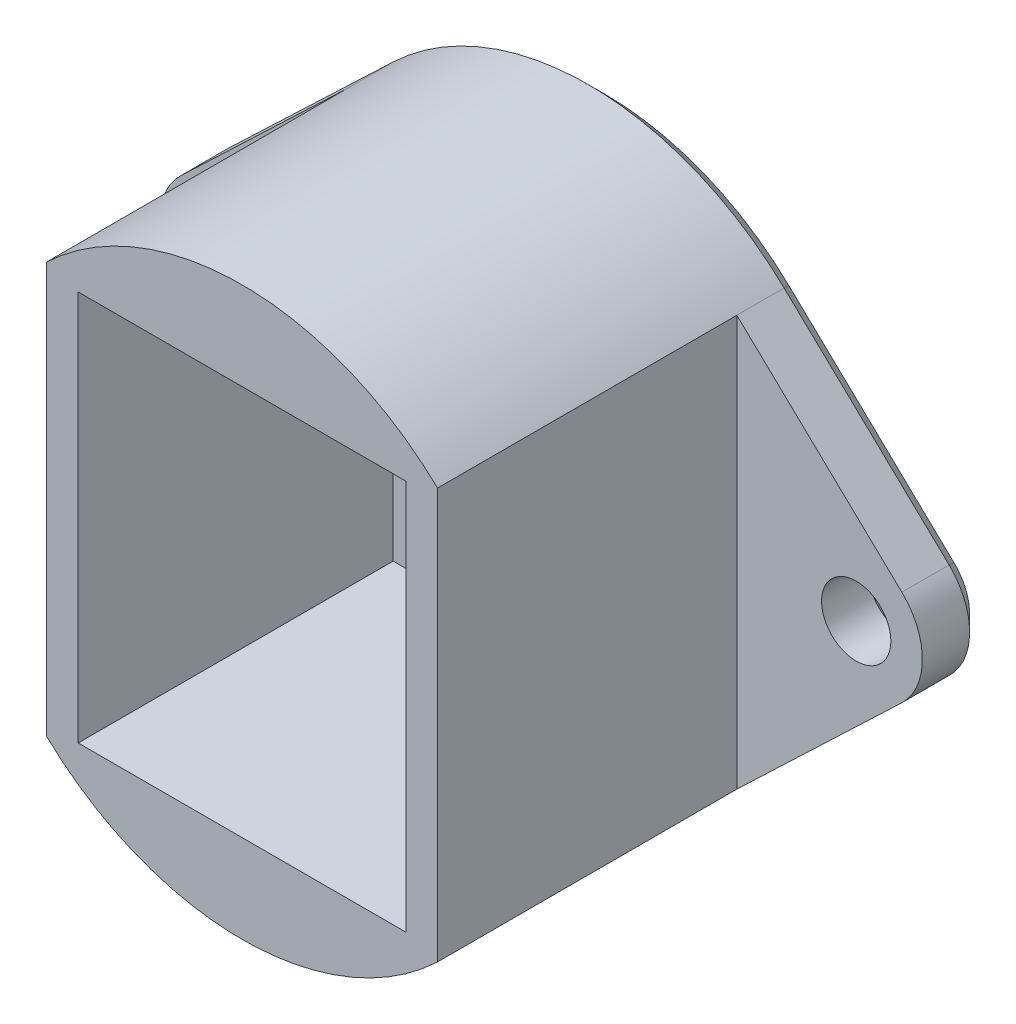
ISO-10303-21;
HEADER;
FILE_DESCRIPTION(('STEP AP214'),'2;1');
FILE_NAME('part.step','',(''),(''),'','','');
FILE_SCHEMA(('AUTOMOTIVE_DESIGN { 1 0 10303 214 1 1 1 1 }'));
ENDSEC;
DATA;
#1=APPLICATION_CONTEXT('core data for automotive mechanical design processes');
#2=APPLICATION_PROTOCOL_DEFINITION('international standard','automotive_design',2000,#1);
#3=PRODUCT_CONTEXT('',#1,'mechanical');
#4=PRODUCT('Part','Part','',(#3));
#5=PRODUCT_RELATED_PRODUCT_CATEGORY('part','',(#4));
#6=PRODUCT_DEFINITION_FORMATION('','',#4);
#7=PRODUCT_DEFINITION_CONTEXT('part definition',#1,'design');
#8=PRODUCT_DEFINITION('design','',#6,#7);
#9=PRODUCT_DEFINITION_SHAPE('','',#8);
#10=(LENGTH_UNIT() NAMED_UNIT(*) SI_UNIT(.MILLI.,.METRE.));
#11=(NAMED_UNIT(*) PLANE_ANGLE_UNIT() SI_UNIT($,.RADIAN.));
#12=(NAMED_UNIT(*) SI_UNIT($,.STERADIAN.) SOLID_ANGLE_UNIT());
#13=UNCERTAINTY_MEASURE_WITH_UNIT(LENGTH_MEASURE(1.E-05),#10,'distance_accuracy_value','');
#14=(GEOMETRIC_REPRESENTATION_CONTEXT(3) GLOBAL_UNCERTAINTY_ASSIGNED_CONTEXT((#13)) GLOBAL_UNIT_ASSIGNED_CONTEXT((#10,
#11,#12)) REPRESENTATION_CONTEXT('',''));
#15=CARTESIAN_POINT('',(0.,0.,0.));
#16=DIRECTION('',(0.,0.,1.));
#17=DIRECTION('',(1.,0.,0.));
#18=AXIS2_PLACEMENT_3D('',#15,#16,#17);
#19=CARTESIAN_POINT('',(0.,0.,2.));
#20=DIRECTION('',(0.,0.,-1.));
#21=DIRECTION('',(-1.,0.,0.));
#22=AXIS2_PLACEMENT_3D('',#19,#20,#21);
#23=CYLINDRICAL_SURFACE('',#22,1.7);
#24=CARTESIAN_POINT('',(0.,0.,0.500000000000002));
#25=DIRECTION('',(0.,0.,1.));
#26=DIRECTION('',(1.,0.,0.));
#27=AXIS2_PLACEMENT_3D('',#24,#25,#26);
#28=CIRCLE('',#27,1.7);
#29=CARTESIAN_POINT('',(1.7,0.,0.500000000000002));
#30=VERTEX_POINT('',#29);
#31=EDGE_CURVE('E324',#30,#30,#28,.F.);
#32=ORIENTED_EDGE('',*,*,#31,.T.);
#33=EDGE_LOOP('',(#32));
#34=FACE_BOUND('',#33,.T.);
#35=CARTESIAN_POINT('',(0.,0.,0.6));
#36=DIRECTION('',(0.,0.,1.));
#37=DIRECTION('',(1.,0.,0.));
#38=AXIS2_PLACEMENT_3D('',#35,#36,#37);
#39=CIRCLE('',#38,1.7);
#40=CARTESIAN_POINT('',(1.7,0.,0.6));
#41=VERTEX_POINT('',#40);
#42=EDGE_CURVE('E193',#41,#41,#39,.T.);
#43=ORIENTED_EDGE('',*,*,#42,.T.);
#44=EDGE_LOOP('',(#43));
#45=FACE_BOUND('',#44,.T.);
#46=ADVANCED_FACE('F37',(#34,#45),#23,.F.);
#47=CARTESIAN_POINT('',(0.,0.,2.));
#48=DIRECTION('',(0.,0.,1.));
#49=DIRECTION('',(1.,0.,0.));
#50=AXIS2_PLACEMENT_3D('',#47,#48,#49);
#51=PLANE('',#50);
#52=DIRECTION('',(0.,-1.,0.));
#53=VECTOR('',#52,1.);
#54=CARTESIAN_POINT('',(-6.21000000000001,-6.51428430451113,2.));
#55=LINE('',#54,#53);
#56=CARTESIAN_POINT('',(-6.21000000000001,6.51428430451113,2.));
#57=VERTEX_POINT('',#56);
#58=CARTESIAN_POINT('',(-6.21,-6.51428430451113,2.));
#59=VERTEX_POINT('',#58);
#60=EDGE_CURVE('E236',#57,#59,#55,.T.);
#61=ORIENTED_EDGE('',*,*,#60,.F.);
#62=DIRECTION('',(-0.723809367167902,-0.690000000000001,0.));
#63=VECTOR('',#62,1.);
#64=CARTESIAN_POINT('',(-6.21000000000001,6.51428430451113,2.));
#65=LINE('',#64,#63);
#66=CARTESIAN_POINT('',(-11.449,1.5199996710526,2.));
#67=VERTEX_POINT('',#66);
#68=EDGE_CURVE('E259',#57,#67,#65,.T.);
#69=ORIENTED_EDGE('',*,*,#68,.T.);
#70=CARTESIAN_POINT('',(-10.,0.,2.));
#71=DIRECTION('',(0.,0.,1.));
#72=DIRECTION('',(-1.,0.,0.));
#73=AXIS2_PLACEMENT_3D('',#70,#71,#72);
#74=CIRCLE('',#73,2.1);
#75=CARTESIAN_POINT('',(-11.449,-1.5199996710526,2.));
#76=VERTEX_POINT('',#75);
#77=EDGE_CURVE('E261',#67,#76,#74,.T.);
#78=ORIENTED_EDGE('',*,*,#77,.T.);
#79=DIRECTION('',(0.723809367167903,-0.69,0.));
#80=VECTOR('',#79,1.);
#81=CARTESIAN_POINT('',(-6.21,-6.51428430451113,2.));
#82=LINE('',#81,#80);
#83=EDGE_CURVE('E263',#76,#59,#82,.T.);
#84=ORIENTED_EDGE('',*,*,#83,.T.);
#85=EDGE_LOOP('',(#61,#69,#78,#84));
#86=FACE_BOUND('',#85,.T.);
#87=CARTESIAN_POINT('',(-10.,0.,2.));
#88=DIRECTION('',(0.,0.,1.));
#89=DIRECTION('',(1.,0.,0.));
#90=AXIS2_PLACEMENT_3D('',#87,#88,#89);
#91=CIRCLE('',#90,1.1);
#92=CARTESIAN_POINT('',(-8.9,0.,2.));
#93=VERTEX_POINT('',#92);
#94=EDGE_CURVE('E253',#93,#93,#91,.T.);
#95=ORIENTED_EDGE('',*,*,#94,.F.);
#96=EDGE_LOOP('',(#95));
#97=FACE_BOUND('',#96,.T.);
#98=ADVANCED_FACE('F402',(#86,#97),#51,.T.);
#99=DIRECTION('',(0.,1.,0.));
#100=VECTOR('',#99,1.);
#101=CARTESIAN_POINT('',(6.21000000000001,6.51428430451113,2.));
#102=LINE('',#101,#100);
#103=CARTESIAN_POINT('',(6.21,-6.51428430451113,2.));
#104=VERTEX_POINT('',#103);
#105=CARTESIAN_POINT('',(6.21000000000001,6.51428430451113,2.));
#106=VERTEX_POINT('',#105);
#107=EDGE_CURVE('E233',#104,#106,#102,.T.);
#108=ORIENTED_EDGE('',*,*,#107,.F.);
#109=DIRECTION('',(0.723809367167903,0.69,0.));
#110=VECTOR('',#109,1.);
#111=CARTESIAN_POINT('',(11.449,-1.51999967105259,2.));
#112=LINE('',#111,#110);
#113=CARTESIAN_POINT('',(11.449,-1.51999967105259,2.));
#114=VERTEX_POINT('',#113);
#115=EDGE_CURVE('E265',#104,#114,#112,.T.);
#116=ORIENTED_EDGE('',*,*,#115,.T.);
#117=CARTESIAN_POINT('',(10.,0.,2.));
#118=DIRECTION('',(0.,0.,1.));
#119=DIRECTION('',(-1.,0.,0.));
#120=AXIS2_PLACEMENT_3D('',#117,#118,#119);
#121=CIRCLE('',#120,2.1);
#122=CARTESIAN_POINT('',(11.449,1.5199996710526,2.));
#123=VERTEX_POINT('',#122);
#124=EDGE_CURVE('E267',#114,#123,#121,.T.);
#125=ORIENTED_EDGE('',*,*,#124,.T.);
#126=DIRECTION('',(-0.723809367167903,0.69,0.));
#127=VECTOR('',#126,1.);
#128=CARTESIAN_POINT('',(6.21000000000001,6.51428430451113,2.));
#129=LINE('',#128,#127);
#130=EDGE_CURVE('E269',#123,#106,#129,.T.);
#131=ORIENTED_EDGE('',*,*,#130,.T.);
#132=EDGE_LOOP('',(#108,#116,#125,#131));
#133=FACE_BOUND('',#132,.T.);
#134=CARTESIAN_POINT('',(10.,0.,2.));
#135=DIRECTION('',(0.,0.,1.));
#136=DIRECTION('',(1.,0.,0.));
#137=AXIS2_PLACEMENT_3D('',#134,#135,#136);
#138=CIRCLE('',#137,1.1);
#139=CARTESIAN_POINT('',(11.1,0.,2.));
#140=VERTEX_POINT('',#139);
#141=EDGE_CURVE('E256',#140,#140,#138,.T.);
#142=ORIENTED_EDGE('',*,*,#141,.F.);
#143=EDGE_LOOP('',(#142));
#144=FACE_BOUND('',#143,.T.);
#145=ADVANCED_FACE('F408',(#133,#144),#51,.T.);
#146=CARTESIAN_POINT('',(0.,0.,0.));
#147=DIRECTION('',(0.,0.,1.));
#148=DIRECTION('',(1.,0.,0.));
#149=AXIS2_PLACEMENT_3D('',#146,#147,#148);
#150=PLANE('',#149);
#151=CARTESIAN_POINT('',(0.,0.,0.));
#152=DIRECTION('',(0.,0.,1.));
#153=DIRECTION('',(1.,0.,0.));
#154=AXIS2_PLACEMENT_3D('',#151,#152,#153);
#155=CIRCLE('',#154,2.2);
#156=CARTESIAN_POINT('',(2.2,0.,0.));
#157=VERTEX_POINT('',#156);
#158=EDGE_CURVE('E318',#157,#157,#155,.T.);
#159=ORIENTED_EDGE('',*,*,#158,.T.);
#160=EDGE_LOOP('',(#159));
#161=FACE_BOUND('',#160,.T.);
#162=CARTESIAN_POINT('',(0.,-4.5,0.));
#163=DIRECTION('',(0.,0.,1.));
#164=DIRECTION('',(1.,0.,0.));
#165=AXIS2_PLACEMENT_3D('',#162,#163,#164);
#166=CIRCLE('',#165,1.49999999999999);
#167=CARTESIAN_POINT('',(1.49999999999999,-4.5,0.));
#168=VERTEX_POINT('',#167);
#169=EDGE_CURVE('E315',#168,#168,#166,.T.);
#170=ORIENTED_EDGE('',*,*,#169,.T.);
#171=EDGE_LOOP('',(#170));
#172=FACE_BOUND('',#171,.T.);
#173=CARTESIAN_POINT('',(0.,4.5,0.));
#174=DIRECTION('',(0.,0.,1.));
#175=DIRECTION('',(1.,0.,0.));
#176=AXIS2_PLACEMENT_3D('',#173,#174,#175);
#177=CIRCLE('',#176,1.49999999999999);
#178=CARTESIAN_POINT('',(1.49999999999999,4.5,0.));
#179=VERTEX_POINT('',#178);
#180=EDGE_CURVE('E312',#179,#179,#177,.T.);
#181=ORIENTED_EDGE('',*,*,#180,.T.);
#182=EDGE_LOOP('',(#181));
#183=FACE_BOUND('',#182,.T.);
#184=DIRECTION('',(-0.723809367167903,0.69,0.));
#185=VECTOR('',#184,1.);
#186=CARTESIAN_POINT('',(-5.865,-6.15237962092718,0.));
#187=LINE('',#186,#185);
#188=CARTESIAN_POINT('',(-5.865,-6.15237962092718,0.));
#189=VERTEX_POINT('',#188);
#190=CARTESIAN_POINT('',(-11.104,-1.15809498746864,0.));
#191=VERTEX_POINT('',#190);
#192=EDGE_CURVE('E308',#189,#191,#187,.T.);
#193=ORIENTED_EDGE('',*,*,#192,.T.);
#194=CARTESIAN_POINT('',(-10.,0.,0.));
#195=DIRECTION('',(0.,0.,1.));
#196=DIRECTION('',(1.,0.,0.));
#197=AXIS2_PLACEMENT_3D('',#194,#195,#196);
#198=CIRCLE('',#197,1.6);
#199=CARTESIAN_POINT('',(-8.4,0.,0.));
#200=VERTEX_POINT('',#199);
#201=EDGE_CURVE('E310',#191,#200,#198,.T.);
#202=ORIENTED_EDGE('',*,*,#201,.T.);
#203=CARTESIAN_POINT('',(-10.,0.,0.));
#204=DIRECTION('',(0.,0.,1.));
#205=DIRECTION('',(1.,0.,0.));
#206=AXIS2_PLACEMENT_3D('',#203,#204,#205);
#207=CIRCLE('',#206,1.6);
#208=CARTESIAN_POINT('',(-11.104,1.15809498746864,0.));
#209=VERTEX_POINT('',#208);
#210=EDGE_CURVE('E301',#200,#209,#207,.T.);
#211=ORIENTED_EDGE('',*,*,#210,.T.);
#212=DIRECTION('',(0.723809367167902,0.690000000000001,0.));
#213=VECTOR('',#212,1.);
#214=CARTESIAN_POINT('',(-5.86500000000001,6.15237962092717,0.));
#215=LINE('',#214,#213);
#216=CARTESIAN_POINT('',(-5.86500000000001,6.15237962092717,0.));
#217=VERTEX_POINT('',#216);
#218=EDGE_CURVE('E297',#209,#217,#215,.T.);
#219=ORIENTED_EDGE('',*,*,#218,.T.);
#220=CARTESIAN_POINT('',(0.,0.,0.));
#221=DIRECTION('',(0.,0.,1.));
#222=DIRECTION('',(1.,0.,0.));
#223=AXIS2_PLACEMENT_3D('',#220,#221,#222);
#224=CIRCLE('',#223,8.5);
#225=CARTESIAN_POINT('',(5.865,6.15237962092717,0.));
#226=VERTEX_POINT('',#225);
#227=EDGE_CURVE('E292',#217,#226,#224,.F.);
#228=ORIENTED_EDGE('',*,*,#227,.T.);
#229=DIRECTION('',(0.723809367167903,-0.69,0.));
#230=VECTOR('',#229,1.);
#231=CARTESIAN_POINT('',(5.86500000000001,6.15237962092718,0.));
#232=LINE('',#231,#230);
#233=CARTESIAN_POINT('',(11.104,1.15809498746865,0.));
#234=VERTEX_POINT('',#233);
#235=EDGE_CURVE('E295',#226,#234,#232,.T.);
#236=ORIENTED_EDGE('',*,*,#235,.T.);
#237=CARTESIAN_POINT('',(10.,0.,0.));
#238=DIRECTION('',(0.,0.,1.));
#239=DIRECTION('',(1.,0.,0.));
#240=AXIS2_PLACEMENT_3D('',#237,#238,#239);
#241=CIRCLE('',#240,1.6);
#242=CARTESIAN_POINT('',(11.104,-1.15809498746864,0.));
#243=VERTEX_POINT('',#242);
#244=EDGE_CURVE('E299',#234,#243,#241,.T.);
#245=ORIENTED_EDGE('',*,*,#244,.T.);
#246=DIRECTION('',(-0.723809367167903,-0.69,0.));
#247=VECTOR('',#246,1.);
#248=CARTESIAN_POINT('',(5.865,-6.15237962092717,0.));
#249=LINE('',#248,#247);
#250=CARTESIAN_POINT('',(5.865,-6.15237962092717,0.));
#251=VERTEX_POINT('',#250);
#252=EDGE_CURVE('E304',#243,#251,#249,.T.);
#253=ORIENTED_EDGE('',*,*,#252,.T.);
#254=CARTESIAN_POINT('',(0.,0.,0.));
#255=DIRECTION('',(0.,0.,1.));
#256=DIRECTION('',(1.,0.,0.));
#257=AXIS2_PLACEMENT_3D('',#254,#255,#256);
#258=CIRCLE('',#257,8.5);
#259=EDGE_CURVE('E306',#251,#189,#258,.F.);
#260=ORIENTED_EDGE('',*,*,#259,.T.);
#261=EDGE_LOOP('',(#193,#202,#211,#219,#228,#236,#245,#253,#260));
#262=FACE_BOUND('',#261,.T.);
#263=ADVANCED_FACE('F430',(#161,#172,#183,#262),#150,.F.);
#264=CARTESIAN_POINT('',(0.,0.,2.));
#265=DIRECTION('',(0.,0.,-1.));
#266=DIRECTION('',(-1.,0.,0.));
#267=AXIS2_PLACEMENT_3D('',#264,#265,#266);
#268=CYLINDRICAL_SURFACE('',#267,9.00000000000001);
#269=DIRECTION('',(0.,0.,-1.));
#270=VECTOR('',#269,1.);
#271=CARTESIAN_POINT('',(6.21000000000001,6.51428430451113,2.));
#272=LINE('',#271,#270);
#273=CARTESIAN_POINT('',(6.21000000000001,6.51428430451113,0.500000000000002));
#274=VERTEX_POINT('',#273);
#275=EDGE_CURVE('E272',#106,#274,#272,.T.);
#276=ORIENTED_EDGE('',*,*,#275,.T.);
#277=CARTESIAN_POINT('',(0.,0.,0.500000000000002));
#278=DIRECTION('',(0.,0.,1.));
#279=DIRECTION('',(1.,0.,0.));
#280=AXIS2_PLACEMENT_3D('',#277,#278,#279);
#281=CIRCLE('',#280,9.00000000000001);
#282=CARTESIAN_POINT('',(-6.21000000000001,6.51428430451113,0.500000000000002));
#283=VERTEX_POINT('',#282);
#284=EDGE_CURVE('E12',#274,#283,#281,.T.);
#285=ORIENTED_EDGE('',*,*,#284,.T.);
#286=DIRECTION('',(0.,0.,-1.));
#287=VECTOR('',#286,1.);
#288=CARTESIAN_POINT('',(-6.21000000000001,6.51428430451113,2.));
#289=LINE('',#288,#287);
#290=EDGE_CURVE('E290',#57,#283,#289,.T.);
#291=ORIENTED_EDGE('',*,*,#290,.F.);
#292=DIRECTION('',(0.,0.,-1.));
#293=VECTOR('',#292,1.);
#294=CARTESIAN_POINT('',(-6.21000000000001,6.51428430451113,44.8690740544725));
#295=LINE('',#294,#293);
#296=CARTESIAN_POINT('',(-6.21000000000001,6.51428430451113,11.5));
#297=VERTEX_POINT('',#296);
#298=EDGE_CURVE('E242',#297,#57,#295,.T.);
#299=ORIENTED_EDGE('',*,*,#298,.F.);
#300=CARTESIAN_POINT('',(0.,0.,11.5));
#301=DIRECTION('',(0.,0.,1.));
#302=DIRECTION('',(1.,0.,0.));
#303=AXIS2_PLACEMENT_3D('',#300,#301,#302);
#304=CIRCLE('',#303,9.00000000000001);
#305=CARTESIAN_POINT('',(6.21000000000001,6.51428430451113,11.5));
#306=VERTEX_POINT('',#305);
#307=EDGE_CURVE('E220',#306,#297,#304,.T.);
#308=ORIENTED_EDGE('',*,*,#307,.F.);
#309=DIRECTION('',(0.,0.,-1.));
#310=VECTOR('',#309,1.);
#311=CARTESIAN_POINT('',(6.21000000000001,6.51428430451113,44.8690740544725));
#312=LINE('',#311,#310);
#313=EDGE_CURVE('E245',#306,#106,#312,.T.);
#314=ORIENTED_EDGE('',*,*,#313,.T.);
#315=EDGE_LOOP('',(#276,#285,#291,#299,#308,#314));
#316=FACE_BOUND('',#315,.T.);
#317=ADVANCED_FACE('F434',(#316),#268,.T.);
#318=CARTESIAN_POINT('',(-6.21000000000001,6.51428430451113,2.));
#319=DIRECTION('',(0.690000000000001,-0.723809367167902,0.));
#320=DIRECTION('',(0.723809367167902,0.690000000000001,0.));
#321=AXIS2_PLACEMENT_3D('',#318,#319,#320);
#322=PLANE('',#321);
#323=ORIENTED_EDGE('',*,*,#290,.T.);
#324=DIRECTION('',(-0.723809367167902,-0.690000000000001,0.));
#325=VECTOR('',#324,1.);
#326=CARTESIAN_POINT('',(-6.21000000000001,6.51428430451113,0.500000000000003));
#327=LINE('',#326,#325);
#328=CARTESIAN_POINT('',(-11.449,1.5199996710526,0.500000000000002));
#329=VERTEX_POINT('',#328);
#330=EDGE_CURVE('E336',#283,#329,#327,.T.);
#331=ORIENTED_EDGE('',*,*,#330,.T.);
#332=DIRECTION('',(0.,0.,-1.));
#333=VECTOR('',#332,1.);
#334=CARTESIAN_POINT('',(-11.449,1.5199996710526,2.));
#335=LINE('',#334,#333);
#336=EDGE_CURVE('E287',#67,#329,#335,.T.);
#337=ORIENTED_EDGE('',*,*,#336,.F.);
#338=ORIENTED_EDGE('',*,*,#68,.F.);
#339=EDGE_LOOP('',(#323,#331,#337,#338));
#340=FACE_BOUND('',#339,.T.);
#341=ADVANCED_FACE('F456',(#340),#322,.F.);
#342=CARTESIAN_POINT('',(-10.,0.,2.));
#343=DIRECTION('',(0.,0.,-1.));
#344=DIRECTION('',(-1.,0.,0.));
#345=AXIS2_PLACEMENT_3D('',#342,#343,#344);
#346=CYLINDRICAL_SURFACE('',#345,2.1);
#347=ORIENTED_EDGE('',*,*,#336,.T.);
#348=CARTESIAN_POINT('',(-10.,0.,0.500000000000002));
#349=DIRECTION('',(0.,0.,1.));
#350=DIRECTION('',(1.,0.,0.));
#351=AXIS2_PLACEMENT_3D('',#348,#349,#350);
#352=CIRCLE('',#351,2.1);
#353=CARTESIAN_POINT('',(-11.449,-1.5199996710526,0.500000000000002));
#354=VERTEX_POINT('',#353);
#355=EDGE_CURVE('E339',#329,#354,#352,.T.);
#356=ORIENTED_EDGE('',*,*,#355,.T.);
#357=DIRECTION('',(0.,0.,-1.));
#358=VECTOR('',#357,1.);
#359=CARTESIAN_POINT('',(-11.449,-1.5199996710526,2.));
#360=LINE('',#359,#358);
#361=EDGE_CURVE('E284',#76,#354,#360,.T.);
#362=ORIENTED_EDGE('',*,*,#361,.F.);
#363=ORIENTED_EDGE('',*,*,#77,.F.);
#364=EDGE_LOOP('',(#347,#356,#362,#363));
#365=FACE_BOUND('',#364,.T.);
#366=ADVANCED_FACE('F452',(#365),#346,.T.);
#367=CARTESIAN_POINT('',(-6.21,-6.51428430451113,2.));
#368=DIRECTION('',(0.69,0.723809367167903,0.));
#369=DIRECTION('',(-0.723809367167903,0.69,0.));
#370=AXIS2_PLACEMENT_3D('',#367,#368,#369);
#371=PLANE('',#370);
#372=ORIENTED_EDGE('',*,*,#361,.T.);
#373=DIRECTION('',(0.723809367167903,-0.69,0.));
#374=VECTOR('',#373,1.);
#375=CARTESIAN_POINT('',(-6.21,-6.51428430451113,0.500000000000002));
#376=LINE('',#375,#374);
#377=CARTESIAN_POINT('',(-6.21,-6.51428430451113,0.500000000000002));
#378=VERTEX_POINT('',#377);
#379=EDGE_CURVE('E341',#354,#378,#376,.T.);
#380=ORIENTED_EDGE('',*,*,#379,.T.);
#381=DIRECTION('',(0.,0.,-1.));
#382=VECTOR('',#381,1.);
#383=CARTESIAN_POINT('',(-6.21,-6.51428430451113,2.));
#384=LINE('',#383,#382);
#385=EDGE_CURVE('E281',#59,#378,#384,.T.);
#386=ORIENTED_EDGE('',*,*,#385,.F.);
#387=ORIENTED_EDGE('',*,*,#83,.F.);
#388=EDGE_LOOP('',(#372,#380,#386,#387));
#389=FACE_BOUND('',#388,.T.);
#390=ADVANCED_FACE('F448',(#389),#371,.F.);
#391=CARTESIAN_POINT('',(0.,0.,2.));
#392=DIRECTION('',(0.,0.,-1.));
#393=DIRECTION('',(-1.,0.,0.));
#394=AXIS2_PLACEMENT_3D('',#391,#392,#393);
#395=CYLINDRICAL_SURFACE('',#394,9.);
#396=ORIENTED_EDGE('',*,*,#385,.T.);
#397=CARTESIAN_POINT('',(0.,0.,0.500000000000002));
#398=DIRECTION('',(0.,0.,1.));
#399=DIRECTION('',(1.,0.,0.));
#400=AXIS2_PLACEMENT_3D('',#397,#398,#399);
#401=CIRCLE('',#400,9.);
#402=CARTESIAN_POINT('',(6.21,-6.51428430451113,0.500000000000002));
#403=VERTEX_POINT('',#402);
#404=EDGE_CURVE('E343',#378,#403,#401,.T.);
#405=ORIENTED_EDGE('',*,*,#404,.T.);
#406=DIRECTION('',(0.,0.,-1.));
#407=VECTOR('',#406,1.);
#408=CARTESIAN_POINT('',(6.21,-6.51428430451113,2.));
#409=LINE('',#408,#407);
#410=EDGE_CURVE('E278',#104,#403,#409,.T.);
#411=ORIENTED_EDGE('',*,*,#410,.F.);
#412=DIRECTION('',(0.,0.,-1.));
#413=VECTOR('',#412,1.);
#414=CARTESIAN_POINT('',(6.21,-6.51428430451113,44.8690740544725));
#415=LINE('',#414,#413);
#416=CARTESIAN_POINT('',(6.21,-6.51428430451113,11.5));
#417=VERTEX_POINT('',#416);
#418=EDGE_CURVE('E248',#417,#104,#415,.T.);
#419=ORIENTED_EDGE('',*,*,#418,.F.);
#420=CARTESIAN_POINT('',(0.,0.,11.5));
#421=DIRECTION('',(0.,0.,1.));
#422=DIRECTION('',(1.,0.,0.));
#423=AXIS2_PLACEMENT_3D('',#420,#421,#422);
#424=CIRCLE('',#423,9.00000000000001);
#425=CARTESIAN_POINT('',(-6.21000000000001,-6.51428430451113,11.5));
#426=VERTEX_POINT('',#425);
#427=EDGE_CURVE('E226',#426,#417,#424,.T.);
#428=ORIENTED_EDGE('',*,*,#427,.F.);
#429=DIRECTION('',(0.,0.,-1.));
#430=VECTOR('',#429,1.);
#431=CARTESIAN_POINT('',(-6.21000000000001,-6.51428430451113,44.8690740544725));
#432=LINE('',#431,#430);
#433=EDGE_CURVE('E239',#426,#59,#432,.T.);
#434=ORIENTED_EDGE('',*,*,#433,.T.);
#435=EDGE_LOOP('',(#396,#405,#411,#419,#428,#434));
#436=FACE_BOUND('',#435,.T.);
#437=ADVANCED_FACE('F444',(#436),#395,.T.);
#438=CARTESIAN_POINT('',(11.449,-1.51999967105259,2.));
#439=DIRECTION('',(-0.69,0.723809367167903,0.));
#440=DIRECTION('',(-0.723809367167903,-0.69,0.));
#441=AXIS2_PLACEMENT_3D('',#438,#439,#440);
#442=PLANE('',#441);
#443=ORIENTED_EDGE('',*,*,#410,.T.);
#444=DIRECTION('',(0.723809367167903,0.69,0.));
#445=VECTOR('',#444,1.);
#446=CARTESIAN_POINT('',(11.449,-1.51999967105259,0.500000000000002));
#447=LINE('',#446,#445);
#448=CARTESIAN_POINT('',(11.449,-1.51999967105259,0.500000000000002));
#449=VERTEX_POINT('',#448);
#450=EDGE_CURVE('E345',#403,#449,#447,.T.);
#451=ORIENTED_EDGE('',*,*,#450,.T.);
#452=DIRECTION('',(0.,0.,-1.));
#453=VECTOR('',#452,1.);
#454=CARTESIAN_POINT('',(11.449,-1.51999967105259,2.));
#455=LINE('',#454,#453);
#456=EDGE_CURVE('E276',#114,#449,#455,.T.);
#457=ORIENTED_EDGE('',*,*,#456,.F.);
#458=ORIENTED_EDGE('',*,*,#115,.F.);
#459=EDGE_LOOP('',(#443,#451,#457,#458));
#460=FACE_BOUND('',#459,.T.);
#461=ADVANCED_FACE('F441',(#460),#442,.F.);
#462=CARTESIAN_POINT('',(10.,0.,2.));
#463=DIRECTION('',(0.,0.,-1.));
#464=DIRECTION('',(-1.,0.,0.));
#465=AXIS2_PLACEMENT_3D('',#462,#463,#464);
#466=CYLINDRICAL_SURFACE('',#465,2.1);
#467=ORIENTED_EDGE('',*,*,#456,.T.);
#468=CARTESIAN_POINT('',(10.,0.,0.500000000000002));
#469=DIRECTION('',(0.,0.,1.));
#470=DIRECTION('',(1.,0.,0.));
#471=AXIS2_PLACEMENT_3D('',#468,#469,#470);
#472=CIRCLE('',#471,2.1);
#473=CARTESIAN_POINT('',(11.449,1.5199996710526,0.500000000000002));
#474=VERTEX_POINT('',#473);
#475=EDGE_CURVE('E61',#449,#474,#472,.T.);
#476=ORIENTED_EDGE('',*,*,#475,.T.);
#477=DIRECTION('',(0.,0.,-1.));
#478=VECTOR('',#477,1.);
#479=CARTESIAN_POINT('',(11.449,1.5199996710526,2.));
#480=LINE('',#479,#478);
#481=EDGE_CURVE('E274',#123,#474,#480,.T.);
#482=ORIENTED_EDGE('',*,*,#481,.F.);
#483=ORIENTED_EDGE('',*,*,#124,.F.);
#484=EDGE_LOOP('',(#467,#476,#482,#483));
#485=FACE_BOUND('',#484,.T.);
#486=ADVANCED_FACE('F438',(#485),#466,.T.);
#487=CARTESIAN_POINT('',(6.21000000000001,6.51428430451113,2.));
#488=DIRECTION('',(-0.69,-0.723809367167903,0.));
#489=DIRECTION('',(0.723809367167903,-0.69,0.));
#490=AXIS2_PLACEMENT_3D('',#487,#488,#489);
#491=PLANE('',#490);
#492=ORIENTED_EDGE('',*,*,#481,.T.);
#493=DIRECTION('',(-0.723809367167903,0.69,0.));
#494=VECTOR('',#493,1.);
#495=CARTESIAN_POINT('',(6.21000000000001,6.51428430451113,0.500000000000002));
#496=LINE('',#495,#494);
#497=EDGE_CURVE('E46',#474,#274,#496,.T.);
#498=ORIENTED_EDGE('',*,*,#497,.T.);
#499=ORIENTED_EDGE('',*,*,#275,.F.);
#500=ORIENTED_EDGE('',*,*,#130,.F.);
#501=EDGE_LOOP('',(#492,#498,#499,#500));
#502=FACE_BOUND('',#501,.T.);
#503=ADVANCED_FACE('F426',(#502),#491,.F.);
#504=CARTESIAN_POINT('',(10.,0.,2.));
#505=DIRECTION('',(0.,0.,-1.));
#506=DIRECTION('',(-1.,0.,0.));
#507=AXIS2_PLACEMENT_3D('',#504,#505,#506);
#508=CYLINDRICAL_SURFACE('',#507,1.1);
#509=CARTESIAN_POINT('',(10.,0.,0.500000000000007));
#510=DIRECTION('',(0.,0.,1.));
#511=DIRECTION('',(1.,0.,0.));
#512=AXIS2_PLACEMENT_3D('',#509,#510,#511);
#513=CIRCLE('',#512,1.1);
#514=CARTESIAN_POINT('',(11.1,0.,0.500000000000007));
#515=VERTEX_POINT('',#514);
#516=EDGE_CURVE('E333',#515,#515,#513,.F.);
#517=ORIENTED_EDGE('',*,*,#516,.T.);
#518=EDGE_LOOP('',(#517));
#519=FACE_BOUND('',#518,.T.);
#520=ORIENTED_EDGE('',*,*,#141,.T.);
#521=EDGE_LOOP('',(#520));
#522=FACE_BOUND('',#521,.T.);
#523=ADVANCED_FACE('F423',(#519,#522),#508,.F.);
#524=CARTESIAN_POINT('',(0.,4.5,2.));
#525=DIRECTION('',(0.,0.,-1.));
#526=DIRECTION('',(-1.,0.,0.));
#527=AXIS2_PLACEMENT_3D('',#524,#525,#526);
#528=CYLINDRICAL_SURFACE('',#527,1.);
#529=CARTESIAN_POINT('',(0.,4.5,0.499999999999998));
#530=DIRECTION('',(0.,0.,1.));
#531=DIRECTION('',(1.,0.,0.));
#532=AXIS2_PLACEMENT_3D('',#529,#530,#531);
#533=CIRCLE('',#532,1.);
#534=CARTESIAN_POINT('',(1.,4.5,0.499999999999998));
#535=VERTEX_POINT('',#534);
#536=EDGE_CURVE('E330',#535,#535,#533,.F.);
#537=ORIENTED_EDGE('',*,*,#536,.T.);
#538=EDGE_LOOP('',(#537));
#539=FACE_BOUND('',#538,.T.);
#540=CARTESIAN_POINT('',(0.,4.5,1.5));
#541=DIRECTION('',(0.,0.,-1.));
#542=DIRECTION('',(-1.,0.,0.));
#543=AXIS2_PLACEMENT_3D('',#540,#541,#542);
#544=CIRCLE('',#543,1.);
#545=CARTESIAN_POINT('',(-1.,4.5,1.5));
#546=VERTEX_POINT('',#545);
#547=EDGE_CURVE('E207',#546,#546,#544,.T.);
#548=ORIENTED_EDGE('',*,*,#547,.F.);
#549=EDGE_LOOP('',(#548));
#550=FACE_BOUND('',#549,.T.);
#551=ADVANCED_FACE('F419',(#539,#550),#528,.F.);
#552=CARTESIAN_POINT('',(0.,-4.5,2.));
#553=DIRECTION('',(0.,0.,-1.));
#554=DIRECTION('',(-1.,0.,0.));
#555=AXIS2_PLACEMENT_3D('',#552,#553,#554);
#556=CYLINDRICAL_SURFACE('',#555,1.);
#557=CARTESIAN_POINT('',(0.,-4.5,0.499999999999998));
#558=DIRECTION('',(0.,0.,1.));
#559=DIRECTION('',(1.,0.,0.));
#560=AXIS2_PLACEMENT_3D('',#557,#558,#559);
#561=CIRCLE('',#560,1.);
#562=CARTESIAN_POINT('',(1.,-4.5,0.499999999999998));
#563=VERTEX_POINT('',#562);
#564=EDGE_CURVE('E327',#563,#563,#561,.F.);
#565=ORIENTED_EDGE('',*,*,#564,.T.);
#566=EDGE_LOOP('',(#565));
#567=FACE_BOUND('',#566,.T.);
#568=CARTESIAN_POINT('',(0.,-4.5,1.5));
#569=DIRECTION('',(0.,0.,-1.));
#570=DIRECTION('',(-1.,0.,0.));
#571=AXIS2_PLACEMENT_3D('',#568,#569,#570);
#572=CIRCLE('',#571,1.);
#573=CARTESIAN_POINT('',(-1.,-4.5,1.5));
#574=VERTEX_POINT('',#573);
#575=EDGE_CURVE('E204',#574,#574,#572,.T.);
#576=ORIENTED_EDGE('',*,*,#575,.F.);
#577=EDGE_LOOP('',(#576));
#578=FACE_BOUND('',#577,.T.);
#579=ADVANCED_FACE('F416',(#567,#578),#556,.F.);
#580=CARTESIAN_POINT('',(-10.,0.,2.));
#581=DIRECTION('',(0.,0.,-1.));
#582=DIRECTION('',(-1.,0.,0.));
#583=AXIS2_PLACEMENT_3D('',#580,#581,#582);
#584=CYLINDRICAL_SURFACE('',#583,1.1);
#585=CARTESIAN_POINT('',(-10.,0.,0.500000000000007));
#586=DIRECTION('',(0.,0.,1.));
#587=DIRECTION('',(1.,0.,0.));
#588=AXIS2_PLACEMENT_3D('',#585,#586,#587);
#589=CIRCLE('',#588,1.1);
#590=CARTESIAN_POINT('',(-8.9,0.,0.500000000000007));
#591=VERTEX_POINT('',#590);
#592=EDGE_CURVE('E321',#591,#591,#589,.F.);
#593=ORIENTED_EDGE('',*,*,#592,.T.);
#594=EDGE_LOOP('',(#593));
#595=FACE_BOUND('',#594,.T.);
#596=ORIENTED_EDGE('',*,*,#94,.T.);
#597=EDGE_LOOP('',(#596));
#598=FACE_BOUND('',#597,.T.);
#599=ADVANCED_FACE('F414',(#595,#598),#584,.F.);
#600=CARTESIAN_POINT('',(-6.21000000000001,-6.51428430451113,44.8690740544725));
#601=DIRECTION('',(1.,0.,0.));
#602=DIRECTION('',(0.,0.,-1.));
#603=AXIS2_PLACEMENT_3D('',#600,#601,#602);
#604=PLANE('',#603);
#605=DIRECTION('',(0.,-1.,0.));
#606=VECTOR('',#605,1.);
#607=CARTESIAN_POINT('',(-6.21000000000001,-6.51428430451113,11.5));
#608=LINE('',#607,#606);
#609=EDGE_CURVE('E217',#297,#426,#608,.T.);
#610=ORIENTED_EDGE('',*,*,#609,.F.);
#611=ORIENTED_EDGE('',*,*,#298,.T.);
#612=ORIENTED_EDGE('',*,*,#60,.T.);
#613=ORIENTED_EDGE('',*,*,#433,.F.);
#614=EDGE_LOOP('',(#610,#611,#612,#613));
#615=FACE_BOUND('',#614,.T.);
#616=ADVANCED_FACE('F544',(#615),#604,.F.);
#617=CARTESIAN_POINT('',(6.21000000000001,6.51428430451113,44.8690740544725));
#618=DIRECTION('',(-1.,0.,0.));
#619=DIRECTION('',(0.,-1.,0.));
#620=AXIS2_PLACEMENT_3D('',#617,#618,#619);
#621=PLANE('',#620);
#622=DIRECTION('',(0.,1.,0.));
#623=VECTOR('',#622,1.);
#624=CARTESIAN_POINT('',(6.21000000000001,6.51428430451113,11.5));
#625=LINE('',#624,#623);
#626=EDGE_CURVE('E223',#417,#306,#625,.T.);
#627=ORIENTED_EDGE('',*,*,#626,.F.);
#628=ORIENTED_EDGE('',*,*,#418,.T.);
#629=ORIENTED_EDGE('',*,*,#107,.T.);
#630=ORIENTED_EDGE('',*,*,#313,.F.);
#631=EDGE_LOOP('',(#627,#628,#629,#630));
#632=FACE_BOUND('',#631,.T.);
#633=ADVANCED_FACE('F549',(#632),#621,.F.);
#634=CARTESIAN_POINT('',(5.2,6.2,44.8690740544725));
#635=DIRECTION('',(0.,-1.,0.));
#636=DIRECTION('',(1.,0.,0.));
#637=AXIS2_PLACEMENT_3D('',#634,#635,#636);
#638=PLANE('',#637);
#639=DIRECTION('',(0.,0.,-1.));
#640=VECTOR('',#639,1.);
#641=CARTESIAN_POINT('',(5.2,6.2,44.8690740544725));
#642=LINE('',#641,#640);
#643=CARTESIAN_POINT('',(5.2,6.2,11.5));
#644=VERTEX_POINT('',#643);
#645=CARTESIAN_POINT('',(5.2,6.2,1.5));
#646=VERTEX_POINT('',#645);
#647=EDGE_CURVE('E168',#644,#646,#642,.T.);
#648=ORIENTED_EDGE('',*,*,#647,.F.);
#649=DIRECTION('',(-1.,0.,0.));
#650=VECTOR('',#649,1.);
#651=CARTESIAN_POINT('',(5.2,6.2,11.5));
#652=LINE('',#651,#650);
#653=CARTESIAN_POINT('',(-5.2,6.2,11.5));
#654=VERTEX_POINT('',#653);
#655=EDGE_CURVE('E251',#644,#654,#652,.T.);
#656=ORIENTED_EDGE('',*,*,#655,.T.);
#657=DIRECTION('',(0.,0.,-1.));
#658=VECTOR('',#657,1.);
#659=CARTESIAN_POINT('',(-5.2,6.2,44.8690740544725));
#660=LINE('',#659,#658);
#661=CARTESIAN_POINT('',(-5.2,6.2,1.5));
#662=VERTEX_POINT('',#661);
#663=EDGE_CURVE('E179',#654,#662,#660,.T.);
#664=ORIENTED_EDGE('',*,*,#663,.T.);
#665=DIRECTION('',(-1.,0.,0.));
#666=VECTOR('',#665,1.);
#667=CARTESIAN_POINT('',(-5.2,6.2,1.5));
#668=LINE('',#667,#666);
#669=EDGE_CURVE('E182',#646,#662,#668,.T.);
#670=ORIENTED_EDGE('',*,*,#669,.F.);
#671=EDGE_LOOP('',(#648,#656,#664,#670));
#672=FACE_BOUND('',#671,.T.);
#673=ADVANCED_FACE('F183',(#672),#638,.T.);
#674=CARTESIAN_POINT('',(5.2,6.2,44.8690740544725));
#675=DIRECTION('',(-1.,0.,0.));
#676=DIRECTION('',(0.,-1.,0.));
#677=AXIS2_PLACEMENT_3D('',#674,#675,#676);
#678=PLANE('',#677);
#679=DIRECTION('',(0.,0.,-1.));
#680=VECTOR('',#679,1.);
#681=CARTESIAN_POINT('',(5.2,-6.2,44.8690740544725));
#682=LINE('',#681,#680);
#683=CARTESIAN_POINT('',(5.2,-6.2,11.5));
#684=VERTEX_POINT('',#683);
#685=CARTESIAN_POINT('',(5.2,-6.2,1.5));
#686=VERTEX_POINT('',#685);
#687=EDGE_CURVE('E178',#684,#686,#682,.T.);
#688=ORIENTED_EDGE('',*,*,#687,.F.);
#689=DIRECTION('',(0.,1.,0.));
#690=VECTOR('',#689,1.);
#691=CARTESIAN_POINT('',(5.2,6.2,11.5));
#692=LINE('',#691,#690);
#693=EDGE_CURVE('E175',#684,#644,#692,.T.);
#694=ORIENTED_EDGE('',*,*,#693,.T.);
#695=ORIENTED_EDGE('',*,*,#647,.T.);
#696=DIRECTION('',(0.,1.,0.));
#697=VECTOR('',#696,1.);
#698=CARTESIAN_POINT('',(5.2,-6.2,1.5));
#699=LINE('',#698,#697);
#700=EDGE_CURVE('E173',#686,#646,#699,.T.);
#701=ORIENTED_EDGE('',*,*,#700,.F.);
#702=EDGE_LOOP('',(#688,#694,#695,#701));
#703=FACE_BOUND('',#702,.T.);
#704=ADVANCED_FACE('F171',(#703),#678,.T.);
#705=CARTESIAN_POINT('',(5.2,-6.2,44.8690740544725));
#706=DIRECTION('',(0.,1.,0.));
#707=DIRECTION('',(-1.,0.,0.));
#708=AXIS2_PLACEMENT_3D('',#705,#706,#707);
#709=PLANE('',#708);
#710=DIRECTION('',(0.,0.,-1.));
#711=VECTOR('',#710,1.);
#712=CARTESIAN_POINT('',(-5.2,-6.2,44.8690740544725));
#713=LINE('',#712,#711);
#714=CARTESIAN_POINT('',(-5.2,-6.2,11.5));
#715=VERTEX_POINT('',#714);
#716=CARTESIAN_POINT('',(-5.2,-6.2,1.5));
#717=VERTEX_POINT('',#716);
#718=EDGE_CURVE('E231',#715,#717,#713,.T.);
#719=ORIENTED_EDGE('',*,*,#718,.F.);
#720=DIRECTION('',(1.,0.,0.));
#721=VECTOR('',#720,1.);
#722=CARTESIAN_POINT('',(5.2,-6.2,11.5));
#723=LINE('',#722,#721);
#724=EDGE_CURVE('E211',#715,#684,#723,.T.);
#725=ORIENTED_EDGE('',*,*,#724,.T.);
#726=ORIENTED_EDGE('',*,*,#687,.T.);
#727=DIRECTION('',(1.,0.,0.));
#728=VECTOR('',#727,1.);
#729=CARTESIAN_POINT('',(-5.2,-6.2,1.5));
#730=LINE('',#729,#728);
#731=EDGE_CURVE('E192',#717,#686,#730,.T.);
#732=ORIENTED_EDGE('',*,*,#731,.F.);
#733=EDGE_LOOP('',(#719,#725,#726,#732));
#734=FACE_BOUND('',#733,.T.);
#735=ADVANCED_FACE('F576',(#734),#709,.T.);
#736=CARTESIAN_POINT('',(-5.2,6.2,44.8690740544725));
#737=DIRECTION('',(1.,0.,0.));
#738=DIRECTION('',(0.,1.,0.));
#739=AXIS2_PLACEMENT_3D('',#736,#737,#738);
#740=PLANE('',#739);
#741=ORIENTED_EDGE('',*,*,#663,.F.);
#742=DIRECTION('',(0.,-1.,0.));
#743=VECTOR('',#742,1.);
#744=CARTESIAN_POINT('',(-5.2,6.2,11.5));
#745=LINE('',#744,#743);
#746=EDGE_CURVE('E214',#654,#715,#745,.T.);
#747=ORIENTED_EDGE('',*,*,#746,.T.);
#748=ORIENTED_EDGE('',*,*,#718,.T.);
#749=DIRECTION('',(0.,-1.,0.));
#750=VECTOR('',#749,1.);
#751=CARTESIAN_POINT('',(-5.2,-6.2,1.5));
#752=LINE('',#751,#750);
#753=EDGE_CURVE('E188',#662,#717,#752,.T.);
#754=ORIENTED_EDGE('',*,*,#753,.F.);
#755=EDGE_LOOP('',(#741,#747,#748,#754));
#756=FACE_BOUND('',#755,.T.);
#757=ADVANCED_FACE('F573',(#756),#740,.T.);
#758=CARTESIAN_POINT('',(0.,0.,11.5));
#759=DIRECTION('',(0.,0.,1.));
#760=DIRECTION('',(1.,0.,0.));
#761=AXIS2_PLACEMENT_3D('',#758,#759,#760);
#762=PLANE('',#761);
#763=ORIENTED_EDGE('',*,*,#746,.F.);
#764=ORIENTED_EDGE('',*,*,#655,.F.);
#765=ORIENTED_EDGE('',*,*,#693,.F.);
#766=ORIENTED_EDGE('',*,*,#724,.F.);
#767=EDGE_LOOP('',(#763,#764,#765,#766));
#768=FACE_BOUND('',#767,.T.);
#769=ORIENTED_EDGE('',*,*,#609,.T.);
#770=ORIENTED_EDGE('',*,*,#427,.T.);
#771=ORIENTED_EDGE('',*,*,#626,.T.);
#772=ORIENTED_EDGE('',*,*,#307,.T.);
#773=EDGE_LOOP('',(#769,#770,#771,#772));
#774=FACE_BOUND('',#773,.T.);
#775=ADVANCED_FACE('F398',(#768,#774),#762,.T.);
#776=CARTESIAN_POINT('',(0.,0.,1.5));
#777=DIRECTION('',(0.,0.,-1.));
#778=DIRECTION('',(-1.,0.,0.));
#779=AXIS2_PLACEMENT_3D('',#776,#777,#778);
#780=PLANE('',#779);
#781=CARTESIAN_POINT('',(0.,0.,1.5));
#782=DIRECTION('',(0.,0.,1.));
#783=DIRECTION('',(1.,0.,0.));
#784=AXIS2_PLACEMENT_3D('',#781,#782,#783);
#785=CIRCLE('',#784,2.25);
#786=CARTESIAN_POINT('',(2.25,0.,1.5));
#787=VERTEX_POINT('',#786);
#788=EDGE_CURVE('E199',#787,#787,#785,.T.);
#789=ORIENTED_EDGE('',*,*,#788,.F.);
#790=EDGE_LOOP('',(#789));
#791=FACE_BOUND('',#790,.T.);
#792=ORIENTED_EDGE('',*,*,#547,.T.);
#793=EDGE_LOOP('',(#792));
#794=FACE_BOUND('',#793,.T.);
#795=ORIENTED_EDGE('',*,*,#575,.T.);
#796=EDGE_LOOP('',(#795));
#797=FACE_BOUND('',#796,.T.);
#798=ORIENTED_EDGE('',*,*,#700,.T.);
#799=ORIENTED_EDGE('',*,*,#669,.T.);
#800=ORIENTED_EDGE('',*,*,#753,.T.);
#801=ORIENTED_EDGE('',*,*,#731,.T.);
#802=EDGE_LOOP('',(#798,#799,#800,#801));
#803=FACE_BOUND('',#802,.T.);
#804=ADVANCED_FACE('F190',(#791,#794,#797,#803),#780,.F.);
#805=CARTESIAN_POINT('',(0.,0.,0.6));
#806=DIRECTION('',(0.,0.,1.));
#807=DIRECTION('',(1.,0.,0.));
#808=AXIS2_PLACEMENT_3D('',#805,#806,#807);
#809=CYLINDRICAL_SURFACE('',#808,2.25);
#810=CARTESIAN_POINT('',(0.,0.,0.6));
#811=DIRECTION('',(0.,0.,1.));
#812=DIRECTION('',(1.,0.,0.));
#813=AXIS2_PLACEMENT_3D('',#810,#811,#812);
#814=CIRCLE('',#813,2.25);
#815=CARTESIAN_POINT('',(2.25,0.,0.6));
#816=VERTEX_POINT('',#815);
#817=EDGE_CURVE('E196',#816,#816,#814,.T.);
#818=ORIENTED_EDGE('',*,*,#817,.F.);
#819=EDGE_LOOP('',(#818));
#820=FACE_BOUND('',#819,.T.);
#821=ORIENTED_EDGE('',*,*,#788,.T.);
#822=EDGE_LOOP('',(#821));
#823=FACE_BOUND('',#822,.T.);
#824=ADVANCED_FACE('F388',(#820,#823),#809,.F.);
#825=CARTESIAN_POINT('',(0.,0.,0.6));
#826=DIRECTION('',(0.,0.,1.));
#827=DIRECTION('',(1.,0.,0.));
#828=AXIS2_PLACEMENT_3D('',#825,#826,#827);
#829=PLANE('',#828);
#830=ORIENTED_EDGE('',*,*,#42,.F.);
#831=EDGE_LOOP('',(#830));
#832=FACE_BOUND('',#831,.T.);
#833=ORIENTED_EDGE('',*,*,#817,.T.);
#834=EDGE_LOOP('',(#833));
#835=FACE_BOUND('',#834,.T.);
#836=ADVANCED_FACE('F386',(#832,#835),#829,.T.);
#837=CARTESIAN_POINT('',(10.,0.,0.));
#838=DIRECTION('',(0.,0.,-1.));
#839=DIRECTION('',(-1.,0.,0.));
#840=AXIS2_PLACEMENT_3D('',#837,#838,#839);
#841=CONICAL_SURFACE('',#840,1.6,0.785398163397445);
#842=ORIENTED_EDGE('',*,*,#516,.F.);
#843=EDGE_LOOP('',(#842));
#844=FACE_BOUND('',#843,.T.);
#845=CARTESIAN_POINT('',(10.,0.,0.));
#846=DIRECTION('',(0.,0.,1.));
#847=DIRECTION('',(1.,0.,0.));
#848=AXIS2_PLACEMENT_3D('',#845,#846,#847);
#849=CIRCLE('',#848,1.6);
#850=EDGE_CURVE('E41',#243,#234,#849,.T.);
#851=ORIENTED_EDGE('',*,*,#850,.F.);
#852=ORIENTED_EDGE('',*,*,#244,.F.);
#853=EDGE_LOOP('',(#851,#852));
#854=FACE_BOUND('',#853,.T.);
#855=ADVANCED_FACE('F395',(#844,#854),#841,.F.);
#856=CARTESIAN_POINT('',(10.,0.,0.500000000000002));
#857=DIRECTION('',(0.,0.,1.));
#858=DIRECTION('',(1.,0.,0.));
#859=AXIS2_PLACEMENT_3D('',#856,#857,#858);
#860=CONICAL_SURFACE('',#859,2.1,0.785398163397448);
#861=DIRECTION('',(0.487903679018718,-0.511810511810768,0.707106781186548));
#862=VECTOR('',#861,1.);
#863=CARTESIAN_POINT('',(11.104,-1.15809498746864,0.));
#864=LINE('',#863,#862);
#865=EDGE_CURVE('E369',#243,#449,#864,.T.);
#866=ORIENTED_EDGE('',*,*,#865,.F.);
#867=ORIENTED_EDGE('',*,*,#850,.T.);
#868=DIRECTION('',(-0.487903679018718,-0.511810511810767,-0.707106781186548));
#869=VECTOR('',#868,1.);
#870=CARTESIAN_POINT('',(11.449,1.5199996710526,0.500000000000002));
#871=LINE('',#870,#869);
#872=EDGE_CURVE('E371',#474,#234,#871,.T.);
#873=ORIENTED_EDGE('',*,*,#872,.F.);
#874=ORIENTED_EDGE('',*,*,#475,.F.);
#875=EDGE_LOOP('',(#866,#867,#873,#874));
#876=FACE_BOUND('',#875,.T.);
#877=ADVANCED_FACE('F496',(#876),#860,.T.);
#878=CARTESIAN_POINT('',(6.21000000000001,6.51428430451113,0.500000000000002));
#879=DIRECTION('',(-0.487903679018719,-0.511810511810768,0.707106781186546));
#880=DIRECTION('',(-0.723809367167903,0.69,0.));
#881=AXIS2_PLACEMENT_3D('',#878,#879,#880);
#882=PLANE('',#881);
#883=ORIENTED_EDGE('',*,*,#872,.T.);
#884=ORIENTED_EDGE('',*,*,#235,.F.);
#885=DIRECTION('',(-0.487903679018717,-0.511810511810767,-0.707106781186549));
#886=VECTOR('',#885,1.);
#887=CARTESIAN_POINT('',(6.21000000000001,6.51428430451113,0.500000000000002));
#888=LINE('',#887,#886);
#889=EDGE_CURVE('E366',#274,#226,#888,.T.);
#890=ORIENTED_EDGE('',*,*,#889,.F.);
#891=ORIENTED_EDGE('',*,*,#497,.F.);
#892=EDGE_LOOP('',(#883,#884,#890,#891));
#893=FACE_BOUND('',#892,.T.);
#894=ADVANCED_FACE('F492',(#893),#882,.F.);
#895=CARTESIAN_POINT('',(11.449,-1.51999967105259,0.500000000000002));
#896=DIRECTION('',(-0.487903679018718,0.511810511810767,0.707106781186548));
#897=DIRECTION('',(0.723809367167903,0.69,0.));
#898=AXIS2_PLACEMENT_3D('',#895,#896,#897);
#899=PLANE('',#898);
#900=ORIENTED_EDGE('',*,*,#865,.T.);
#901=ORIENTED_EDGE('',*,*,#450,.F.);
#902=DIRECTION('',(0.487903679018719,-0.511810511810768,0.707106781186547));
#903=VECTOR('',#902,1.);
#904=CARTESIAN_POINT('',(5.865,-6.15237962092717,0.));
#905=LINE('',#904,#903);
#906=EDGE_CURVE('E363',#251,#403,#905,.T.);
#907=ORIENTED_EDGE('',*,*,#906,.F.);
#908=ORIENTED_EDGE('',*,*,#252,.F.);
#909=EDGE_LOOP('',(#900,#901,#907,#908));
#910=FACE_BOUND('',#909,.T.);
#911=ADVANCED_FACE('F488',(#910),#899,.F.);
#912=CARTESIAN_POINT('',(0.,0.,0.500000000000002));
#913=DIRECTION('',(0.,0.,1.));
#914=DIRECTION('',(1.,0.,0.));
#915=AXIS2_PLACEMENT_3D('',#912,#913,#914);
#916=CONICAL_SURFACE('',#915,9.00000000000001,0.785398163397448);
#917=ORIENTED_EDGE('',*,*,#889,.T.);
#918=ORIENTED_EDGE('',*,*,#227,.F.);
#919=DIRECTION('',(0.487903679018718,-0.511810511810768,-0.707106781186548));
#920=VECTOR('',#919,1.);
#921=CARTESIAN_POINT('',(-6.21000000000001,6.51428430451113,0.500000000000002));
#922=LINE('',#921,#920);
#923=EDGE_CURVE('E360',#283,#217,#922,.T.);
#924=ORIENTED_EDGE('',*,*,#923,.F.);
#925=ORIENTED_EDGE('',*,*,#284,.F.);
#926=EDGE_LOOP('',(#917,#918,#924,#925));
#927=FACE_BOUND('',#926,.T.);
#928=ADVANCED_FACE('F484',(#927),#916,.T.);
#929=CARTESIAN_POINT('',(0.,0.,0.500000000000002));
#930=DIRECTION('',(0.,0.,1.));
#931=DIRECTION('',(1.,0.,0.));
#932=AXIS2_PLACEMENT_3D('',#929,#930,#931);
#933=CONICAL_SURFACE('',#932,9.,0.785398163397448);
#934=ORIENTED_EDGE('',*,*,#906,.T.);
#935=ORIENTED_EDGE('',*,*,#404,.F.);
#936=DIRECTION('',(-0.487903679018718,-0.511810511810768,0.707106781186548));
#937=VECTOR('',#936,1.);
#938=CARTESIAN_POINT('',(-5.865,-6.15237962092718,0.));
#939=LINE('',#938,#937);
#940=EDGE_CURVE('E357',#189,#378,#939,.T.);
#941=ORIENTED_EDGE('',*,*,#940,.F.);
#942=ORIENTED_EDGE('',*,*,#259,.F.);
#943=EDGE_LOOP('',(#934,#935,#941,#942));
#944=FACE_BOUND('',#943,.T.);
#945=ADVANCED_FACE('F480',(#944),#933,.T.);
#946=CARTESIAN_POINT('',(-6.21000000000001,6.51428430451113,0.500000000000002));
#947=DIRECTION('',(0.487903679018718,-0.511810511810767,0.707106781186549));
#948=DIRECTION('',(-0.723809367167902,-0.690000000000001,0.));
#949=AXIS2_PLACEMENT_3D('',#946,#947,#948);
#950=PLANE('',#949);
#951=ORIENTED_EDGE('',*,*,#923,.T.);
#952=ORIENTED_EDGE('',*,*,#218,.F.);
#953=DIRECTION('',(0.487903679018719,-0.511810511810768,-0.707106781186547));
#954=VECTOR('',#953,1.);
#955=CARTESIAN_POINT('',(-11.449,1.5199996710526,0.500000000000003));
#956=LINE('',#955,#954);
#957=EDGE_CURVE('E354',#329,#209,#956,.T.);
#958=ORIENTED_EDGE('',*,*,#957,.F.);
#959=ORIENTED_EDGE('',*,*,#330,.F.);
#960=EDGE_LOOP('',(#951,#952,#958,#959));
#961=FACE_BOUND('',#960,.T.);
#962=ADVANCED_FACE('F476',(#961),#950,.F.);
#963=CARTESIAN_POINT('',(-6.21,-6.51428430451113,0.500000000000002));
#964=DIRECTION('',(0.487903679018717,0.511810511810767,0.707106781186548));
#965=DIRECTION('',(0.723809367167903,-0.69,0.));
#966=AXIS2_PLACEMENT_3D('',#963,#964,#965);
#967=PLANE('',#966);
#968=ORIENTED_EDGE('',*,*,#940,.T.);
#969=ORIENTED_EDGE('',*,*,#379,.F.);
#970=DIRECTION('',(-0.48790367901872,-0.511810511810768,0.707106781186546));
#971=VECTOR('',#970,1.);
#972=CARTESIAN_POINT('',(-11.104,-1.15809498746864,0.));
#973=LINE('',#972,#971);
#974=EDGE_CURVE('E351',#191,#354,#973,.T.);
#975=ORIENTED_EDGE('',*,*,#974,.F.);
#976=ORIENTED_EDGE('',*,*,#192,.F.);
#977=EDGE_LOOP('',(#968,#969,#975,#976));
#978=FACE_BOUND('',#977,.T.);
#979=ADVANCED_FACE('F472',(#978),#967,.F.);
#980=CARTESIAN_POINT('',(-10.,0.,0.500000000000002));
#981=DIRECTION('',(0.,0.,1.));
#982=DIRECTION('',(1.,0.,0.));
#983=AXIS2_PLACEMENT_3D('',#980,#981,#982);
#984=CONICAL_SURFACE('',#983,2.1,0.785398163397449);
#985=ORIENTED_EDGE('',*,*,#355,.F.);
#986=ORIENTED_EDGE('',*,*,#957,.T.);
#987=CARTESIAN_POINT('',(-10.,0.,0.));
#988=DIRECTION('',(0.,0.,1.));
#989=DIRECTION('',(1.,0.,0.));
#990=AXIS2_PLACEMENT_3D('',#987,#988,#989);
#991=CIRCLE('',#990,1.6);
#992=EDGE_CURVE('E349',#191,#209,#991,.F.);
#993=ORIENTED_EDGE('',*,*,#992,.F.);
#994=ORIENTED_EDGE('',*,*,#974,.T.);
#995=EDGE_LOOP('',(#985,#986,#993,#994));
#996=FACE_BOUND('',#995,.T.);
#997=ADVANCED_FACE('F468',(#996),#984,.T.);
#998=CARTESIAN_POINT('',(-10.,0.,0.));
#999=DIRECTION('',(0.,0.,-1.));
#1000=DIRECTION('',(-1.,0.,0.));
#1001=AXIS2_PLACEMENT_3D('',#998,#999,#1000);
#1002=CONICAL_SURFACE('',#1001,1.6,0.785398163397445);
#1003=ORIENTED_EDGE('',*,*,#592,.F.);
#1004=EDGE_LOOP('',(#1003));
#1005=FACE_BOUND('',#1004,.T.);
#1006=ORIENTED_EDGE('',*,*,#992,.T.);
#1007=ORIENTED_EDGE('',*,*,#210,.F.);
#1008=ORIENTED_EDGE('',*,*,#201,.F.);
#1009=EDGE_LOOP('',(#1006,#1007,#1008));
#1010=FACE_BOUND('',#1009,.T.);
#1011=ADVANCED_FACE('F464',(#1005,#1010),#1002,.F.);
#1012=CARTESIAN_POINT('',(0.,0.,0.));
#1013=DIRECTION('',(0.,0.,-1.));
#1014=DIRECTION('',(-1.,0.,0.));
#1015=AXIS2_PLACEMENT_3D('',#1012,#1013,#1014);
#1016=CONICAL_SURFACE('',#1015,2.2,0.785398163397444);
#1017=ORIENTED_EDGE('',*,*,#31,.F.);
#1018=EDGE_LOOP('',(#1017));
#1019=FACE_BOUND('',#1018,.T.);
#1020=ORIENTED_EDGE('',*,*,#158,.F.);
#1021=EDGE_LOOP('',(#1020));
#1022=FACE_BOUND('',#1021,.T.);
#1023=ADVANCED_FACE('F467',(#1019,#1022),#1016,.F.);
#1024=CARTESIAN_POINT('',(0.,-4.5,0.));
#1025=DIRECTION('',(0.,0.,-1.));
#1026=DIRECTION('',(-1.,0.,0.));
#1027=AXIS2_PLACEMENT_3D('',#1024,#1025,#1026);
#1028=CONICAL_SURFACE('',#1027,1.49999999999999,0.785398163397445);
#1029=ORIENTED_EDGE('',*,*,#564,.F.);
#1030=EDGE_LOOP('',(#1029));
#1031=FACE_BOUND('',#1030,.T.);
#1032=ORIENTED_EDGE('',*,*,#169,.F.);
#1033=EDGE_LOOP('',(#1032));
#1034=FACE_BOUND('',#1033,.T.);
#1035=ADVANCED_FACE('F503',(#1031,#1034),#1028,.F.);
#1036=CARTESIAN_POINT('',(0.,4.5,0.));
#1037=DIRECTION('',(0.,0.,-1.));
#1038=DIRECTION('',(-1.,0.,0.));
#1039=AXIS2_PLACEMENT_3D('',#1036,#1037,#1038);
#1040=CONICAL_SURFACE('',#1039,1.49999999999999,0.785398163397445);
#1041=ORIENTED_EDGE('',*,*,#536,.F.);
#1042=EDGE_LOOP('',(#1041));
#1043=FACE_BOUND('',#1042,.T.);
#1044=ORIENTED_EDGE('',*,*,#180,.F.);
#1045=EDGE_LOOP('',(#1044));
#1046=FACE_BOUND('',#1045,.T.);
#1047=ADVANCED_FACE('F39',(#1043,#1046),#1040,.F.);
#1048=CLOSED_SHELL('',(#46,#98,#145,#263,#317,#341,#366,#390,#437,#461,#486,#503,#523,#551,#579,
#599,#616,#633,#673,#704,#735,#757,#775,#804,#824,#836,#855,#877,#894,#911,#928,#945,#962,#979,
#997,#1011,#1023,#1035,#1047));
#1049=MANIFOLD_SOLID_BREP('B2',#1048);
#1050=ADVANCED_BREP_SHAPE_REPRESENTATION('',(#18,#1049),#14);
#1051=SHAPE_DEFINITION_REPRESENTATION(#9,#1050);
ENDSEC;
END-ISO-10303-21;
